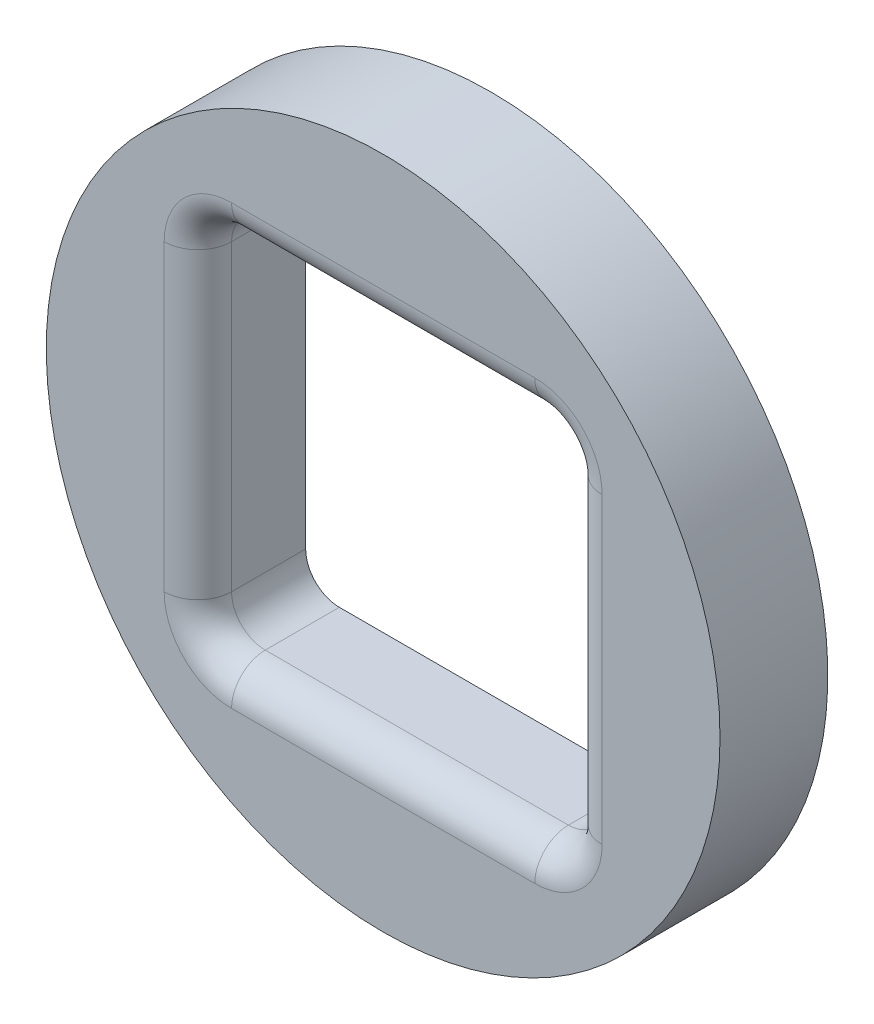
ISO-10303-21;
HEADER;
FILE_DESCRIPTION(('STEP AP214'),'2;1');
FILE_NAME('part.step','',(''),(''),'','','');
FILE_SCHEMA(('AUTOMOTIVE_DESIGN { 1 0 10303 214 1 1 1 1 }'));
ENDSEC;
DATA;
#1=APPLICATION_CONTEXT('core data for automotive mechanical design processes');
#2=APPLICATION_PROTOCOL_DEFINITION('international standard','automotive_design',2000,#1);
#3=PRODUCT_CONTEXT('',#1,'mechanical');
#4=PRODUCT('Part','Part','',(#3));
#5=PRODUCT_RELATED_PRODUCT_CATEGORY('part','',(#4));
#6=PRODUCT_DEFINITION_FORMATION('','',#4);
#7=PRODUCT_DEFINITION_CONTEXT('part definition',#1,'design');
#8=PRODUCT_DEFINITION('design','',#6,#7);
#9=PRODUCT_DEFINITION_SHAPE('','',#8);
#10=(LENGTH_UNIT() NAMED_UNIT(*) SI_UNIT(.MILLI.,.METRE.));
#11=(NAMED_UNIT(*) PLANE_ANGLE_UNIT() SI_UNIT($,.RADIAN.));
#12=(NAMED_UNIT(*) SI_UNIT($,.STERADIAN.) SOLID_ANGLE_UNIT());
#13=UNCERTAINTY_MEASURE_WITH_UNIT(LENGTH_MEASURE(1.E-05),#10,'distance_accuracy_value','');
#14=(GEOMETRIC_REPRESENTATION_CONTEXT(3) GLOBAL_UNCERTAINTY_ASSIGNED_CONTEXT((#13)) GLOBAL_UNIT_ASSIGNED_CONTEXT((#10,
#11,#12)) REPRESENTATION_CONTEXT('',''));
#15=CARTESIAN_POINT('',(0.,0.,0.));
#16=DIRECTION('',(0.,0.,1.));
#17=DIRECTION('',(1.,0.,0.));
#18=AXIS2_PLACEMENT_3D('',#15,#16,#17);
#19=CARTESIAN_POINT('',(16.25,0.,52.5));
#20=DIRECTION('',(0.,-1.,0.));
#21=DIRECTION('',(1.,0.,0.));
#22=AXIS2_PLACEMENT_3D('',#19,#20,#21);
#23=CYLINDRICAL_SURFACE('',#22,2.5);
#24=CARTESIAN_POINT('',(16.25,-11.25,52.5));
#25=DIRECTION('',(0.,-1.,0.));
#26=DIRECTION('',(0.,0.,-1.));
#27=AXIS2_PLACEMENT_3D('',#24,#25,#26);
#28=CIRCLE('',#27,2.5);
#29=CARTESIAN_POINT('',(16.25,-11.25,55.));
#30=VERTEX_POINT('',#29);
#31=CARTESIAN_POINT('',(13.75,-11.25,52.5));
#32=VERTEX_POINT('',#31);
#33=EDGE_CURVE('E54',#30,#32,#28,.T.);
#34=ORIENTED_EDGE('',*,*,#33,.F.);
#35=DIRECTION('',(0.,-1.,0.));
#36=VECTOR('',#35,1.);
#37=CARTESIAN_POINT('',(16.25,0.,55.));
#38=LINE('',#37,#36);
#39=CARTESIAN_POINT('',(16.25,11.25,55.));
#40=VERTEX_POINT('',#39);
#41=EDGE_CURVE('E187',#40,#30,#38,.T.);
#42=ORIENTED_EDGE('',*,*,#41,.F.);
#43=CARTESIAN_POINT('',(16.25,11.25,52.5));
#44=DIRECTION('',(0.,-1.,0.));
#45=DIRECTION('',(0.,0.,-1.));
#46=AXIS2_PLACEMENT_3D('',#43,#44,#45);
#47=CIRCLE('',#46,2.5);
#48=CARTESIAN_POINT('',(13.75,11.25,52.5));
#49=VERTEX_POINT('',#48);
#50=EDGE_CURVE('E68',#40,#49,#47,.T.);
#51=ORIENTED_EDGE('',*,*,#50,.T.);
#52=DIRECTION('',(0.,-1.,0.));
#53=VECTOR('',#52,1.);
#54=CARTESIAN_POINT('',(13.75,13.75,52.5));
#55=LINE('',#54,#53);
#56=EDGE_CURVE('E244',#32,#49,#55,.F.);
#57=ORIENTED_EDGE('',*,*,#56,.F.);
#58=EDGE_LOOP('',(#34,#42,#51,#57));
#59=FACE_BOUND('',#58,.T.);
#60=ADVANCED_FACE('F46',(#59),#23,.T.);
#61=CARTESIAN_POINT('',(11.25,11.25,52.5));
#62=DIRECTION('',(0.,0.,1.));
#63=DIRECTION('',(1.,0.,0.));
#64=AXIS2_PLACEMENT_3D('',#61,#62,#63);
#65=TOROIDAL_SURFACE('',#64,5.,2.5);
#66=ORIENTED_EDGE('',*,*,#50,.F.);
#67=CARTESIAN_POINT('',(11.25,11.25,55.));
#68=DIRECTION('',(0.,0.,1.));
#69=DIRECTION('',(1.,0.,0.));
#70=AXIS2_PLACEMENT_3D('',#67,#68,#69);
#71=CIRCLE('',#70,5.);
#72=CARTESIAN_POINT('',(11.25,16.25,55.));
#73=VERTEX_POINT('',#72);
#74=EDGE_CURVE('E191',#73,#40,#71,.F.);
#75=ORIENTED_EDGE('',*,*,#74,.F.);
#76=CARTESIAN_POINT('',(11.25,16.25,52.5));
#77=DIRECTION('',(1.,0.,0.));
#78=DIRECTION('',(0.,0.,-1.));
#79=AXIS2_PLACEMENT_3D('',#76,#77,#78);
#80=CIRCLE('',#79,2.5);
#81=CARTESIAN_POINT('',(11.25,13.75,52.5));
#82=VERTEX_POINT('',#81);
#83=EDGE_CURVE('E264',#73,#82,#80,.T.);
#84=ORIENTED_EDGE('',*,*,#83,.T.);
#85=CARTESIAN_POINT('',(11.25,11.25,52.5));
#86=DIRECTION('',(0.,0.,1.));
#87=DIRECTION('',(1.,0.,0.));
#88=AXIS2_PLACEMENT_3D('',#85,#86,#87);
#89=CIRCLE('',#88,2.5);
#90=EDGE_CURVE('E154',#49,#82,#89,.T.);
#91=ORIENTED_EDGE('',*,*,#90,.F.);
#92=EDGE_LOOP('',(#66,#75,#84,#91));
#93=FACE_BOUND('',#92,.T.);
#94=ADVANCED_FACE('F297',(#93),#65,.T.);
#95=CARTESIAN_POINT('',(0.,16.25,52.5));
#96=DIRECTION('',(1.,0.,0.));
#97=DIRECTION('',(0.,0.,-1.));
#98=AXIS2_PLACEMENT_3D('',#95,#96,#97);
#99=CYLINDRICAL_SURFACE('',#98,2.5);
#100=ORIENTED_EDGE('',*,*,#83,.F.);
#101=DIRECTION('',(1.,0.,0.));
#102=VECTOR('',#101,1.);
#103=CARTESIAN_POINT('',(0.,16.25,55.));
#104=LINE('',#103,#102);
#105=CARTESIAN_POINT('',(-11.25,16.25,55.));
#106=VERTEX_POINT('',#105);
#107=EDGE_CURVE('E195',#106,#73,#104,.T.);
#108=ORIENTED_EDGE('',*,*,#107,.F.);
#109=CARTESIAN_POINT('',(-11.25,16.25,52.5));
#110=DIRECTION('',(1.,0.,0.));
#111=DIRECTION('',(0.,0.,-1.));
#112=AXIS2_PLACEMENT_3D('',#109,#110,#111);
#113=CIRCLE('',#112,2.5);
#114=CARTESIAN_POINT('',(-11.25,13.75,52.5));
#115=VERTEX_POINT('',#114);
#116=EDGE_CURVE('E261',#106,#115,#113,.T.);
#117=ORIENTED_EDGE('',*,*,#116,.T.);
#118=DIRECTION('',(1.,0.,0.));
#119=VECTOR('',#118,1.);
#120=CARTESIAN_POINT('',(-13.75,13.75,52.5));
#121=LINE('',#120,#119);
#122=EDGE_CURVE('E239',#82,#115,#121,.F.);
#123=ORIENTED_EDGE('',*,*,#122,.F.);
#124=EDGE_LOOP('',(#100,#108,#117,#123));
#125=FACE_BOUND('',#124,.T.);
#126=ADVANCED_FACE('F332',(#125),#99,.T.);
#127=CARTESIAN_POINT('',(-11.25,11.25,52.5));
#128=DIRECTION('',(0.,0.,1.));
#129=DIRECTION('',(1.,0.,0.));
#130=AXIS2_PLACEMENT_3D('',#127,#128,#129);
#131=TOROIDAL_SURFACE('',#130,5.,2.5);
#132=ORIENTED_EDGE('',*,*,#116,.F.);
#133=CARTESIAN_POINT('',(-11.25,11.25,55.));
#134=DIRECTION('',(0.,0.,1.));
#135=DIRECTION('',(1.,0.,0.));
#136=AXIS2_PLACEMENT_3D('',#133,#134,#135);
#137=CIRCLE('',#136,5.);
#138=CARTESIAN_POINT('',(-16.25,11.25,55.));
#139=VERTEX_POINT('',#138);
#140=EDGE_CURVE('E199',#139,#106,#137,.F.);
#141=ORIENTED_EDGE('',*,*,#140,.F.);
#142=CARTESIAN_POINT('',(-16.25,11.25,52.5));
#143=DIRECTION('',(0.,1.,0.));
#144=DIRECTION('',(0.,0.,1.));
#145=AXIS2_PLACEMENT_3D('',#142,#143,#144);
#146=CIRCLE('',#145,2.5);
#147=CARTESIAN_POINT('',(-13.75,11.25,52.5));
#148=VERTEX_POINT('',#147);
#149=EDGE_CURVE('E257',#139,#148,#146,.T.);
#150=ORIENTED_EDGE('',*,*,#149,.T.);
#151=CARTESIAN_POINT('',(-11.25,11.25,52.5));
#152=DIRECTION('',(0.,0.,1.));
#153=DIRECTION('',(1.,0.,0.));
#154=AXIS2_PLACEMENT_3D('',#151,#152,#153);
#155=CIRCLE('',#154,2.5);
#156=EDGE_CURVE('E235',#115,#148,#155,.T.);
#157=ORIENTED_EDGE('',*,*,#156,.F.);
#158=EDGE_LOOP('',(#132,#141,#150,#157));
#159=FACE_BOUND('',#158,.T.);
#160=ADVANCED_FACE('F336',(#159),#131,.T.);
#161=CARTESIAN_POINT('',(-16.25,0.,52.5));
#162=DIRECTION('',(0.,1.,0.));
#163=DIRECTION('',(-1.,0.,0.));
#164=AXIS2_PLACEMENT_3D('',#161,#162,#163);
#165=CYLINDRICAL_SURFACE('',#164,2.5);
#166=ORIENTED_EDGE('',*,*,#149,.F.);
#167=DIRECTION('',(0.,1.,0.));
#168=VECTOR('',#167,1.);
#169=CARTESIAN_POINT('',(-16.25,0.,55.));
#170=LINE('',#169,#168);
#171=CARTESIAN_POINT('',(-16.25,-11.25,55.));
#172=VERTEX_POINT('',#171);
#173=EDGE_CURVE('E203',#172,#139,#170,.T.);
#174=ORIENTED_EDGE('',*,*,#173,.F.);
#175=CARTESIAN_POINT('',(-16.25,-11.25,52.5));
#176=DIRECTION('',(0.,1.,0.));
#177=DIRECTION('',(0.,0.,1.));
#178=AXIS2_PLACEMENT_3D('',#175,#176,#177);
#179=CIRCLE('',#178,2.5);
#180=CARTESIAN_POINT('',(-13.75,-11.25,52.5));
#181=VERTEX_POINT('',#180);
#182=EDGE_CURVE('E254',#172,#181,#179,.T.);
#183=ORIENTED_EDGE('',*,*,#182,.T.);
#184=DIRECTION('',(0.,1.,0.));
#185=VECTOR('',#184,1.);
#186=CARTESIAN_POINT('',(-13.75,13.75,52.5));
#187=LINE('',#186,#185);
#188=EDGE_CURVE('E231',#148,#181,#187,.F.);
#189=ORIENTED_EDGE('',*,*,#188,.F.);
#190=EDGE_LOOP('',(#166,#174,#183,#189));
#191=FACE_BOUND('',#190,.T.);
#192=ADVANCED_FACE('F342',(#191),#165,.T.);
#193=CARTESIAN_POINT('',(-11.25,-11.25,52.5));
#194=DIRECTION('',(0.,0.,1.));
#195=DIRECTION('',(1.,0.,0.));
#196=AXIS2_PLACEMENT_3D('',#193,#194,#195);
#197=TOROIDAL_SURFACE('',#196,5.,2.5);
#198=ORIENTED_EDGE('',*,*,#182,.F.);
#199=CARTESIAN_POINT('',(-11.25,-11.25,55.));
#200=DIRECTION('',(0.,0.,1.));
#201=DIRECTION('',(1.,0.,0.));
#202=AXIS2_PLACEMENT_3D('',#199,#200,#201);
#203=CIRCLE('',#202,5.);
#204=CARTESIAN_POINT('',(-11.25,-16.25,55.));
#205=VERTEX_POINT('',#204);
#206=EDGE_CURVE('E207',#205,#172,#203,.F.);
#207=ORIENTED_EDGE('',*,*,#206,.F.);
#208=CARTESIAN_POINT('',(-11.25,-16.25,52.5));
#209=DIRECTION('',(-1.,0.,0.));
#210=DIRECTION('',(0.,0.,1.));
#211=AXIS2_PLACEMENT_3D('',#208,#209,#210);
#212=CIRCLE('',#211,2.5);
#213=CARTESIAN_POINT('',(-11.25,-13.75,52.5));
#214=VERTEX_POINT('',#213);
#215=EDGE_CURVE('E250',#205,#214,#212,.T.);
#216=ORIENTED_EDGE('',*,*,#215,.T.);
#217=CARTESIAN_POINT('',(-11.25,-11.25,52.5));
#218=DIRECTION('',(0.,0.,1.));
#219=DIRECTION('',(1.,0.,0.));
#220=AXIS2_PLACEMENT_3D('',#217,#218,#219);
#221=CIRCLE('',#220,2.5);
#222=EDGE_CURVE('E227',#181,#214,#221,.T.);
#223=ORIENTED_EDGE('',*,*,#222,.F.);
#224=EDGE_LOOP('',(#198,#207,#216,#223));
#225=FACE_BOUND('',#224,.T.);
#226=ADVANCED_FACE('F346',(#225),#197,.T.);
#227=CARTESIAN_POINT('',(0.,-16.25,52.5));
#228=DIRECTION('',(-1.,0.,0.));
#229=DIRECTION('',(0.,0.,1.));
#230=AXIS2_PLACEMENT_3D('',#227,#228,#229);
#231=CYLINDRICAL_SURFACE('',#230,2.5);
#232=ORIENTED_EDGE('',*,*,#215,.F.);
#233=DIRECTION('',(-1.,0.,0.));
#234=VECTOR('',#233,1.);
#235=CARTESIAN_POINT('',(0.,-16.25,55.));
#236=LINE('',#235,#234);
#237=CARTESIAN_POINT('',(11.25,-16.25,55.));
#238=VERTEX_POINT('',#237);
#239=EDGE_CURVE('E211',#238,#205,#236,.T.);
#240=ORIENTED_EDGE('',*,*,#239,.F.);
#241=CARTESIAN_POINT('',(11.25,-16.25,52.5));
#242=DIRECTION('',(-1.,0.,0.));
#243=DIRECTION('',(0.,0.,1.));
#244=AXIS2_PLACEMENT_3D('',#241,#242,#243);
#245=CIRCLE('',#244,2.5);
#246=CARTESIAN_POINT('',(11.25,-13.75,52.5));
#247=VERTEX_POINT('',#246);
#248=EDGE_CURVE('E247',#238,#247,#245,.T.);
#249=ORIENTED_EDGE('',*,*,#248,.T.);
#250=DIRECTION('',(-1.,0.,0.));
#251=VECTOR('',#250,1.);
#252=CARTESIAN_POINT('',(-13.75,-13.75,52.5));
#253=LINE('',#252,#251);
#254=EDGE_CURVE('E223',#214,#247,#253,.F.);
#255=ORIENTED_EDGE('',*,*,#254,.F.);
#256=EDGE_LOOP('',(#232,#240,#249,#255));
#257=FACE_BOUND('',#256,.T.);
#258=ADVANCED_FACE('F288',(#257),#231,.T.);
#259=CARTESIAN_POINT('',(11.25,-11.25,52.5));
#260=DIRECTION('',(0.,0.,1.));
#261=DIRECTION('',(1.,0.,0.));
#262=AXIS2_PLACEMENT_3D('',#259,#260,#261);
#263=TOROIDAL_SURFACE('',#262,5.,2.5);
#264=CARTESIAN_POINT('',(11.25,-11.25,55.));
#265=DIRECTION('',(0.,0.,1.));
#266=DIRECTION('',(1.,0.,0.));
#267=AXIS2_PLACEMENT_3D('',#264,#265,#266);
#268=CIRCLE('',#267,5.);
#269=EDGE_CURVE('E215',#30,#238,#268,.F.);
#270=ORIENTED_EDGE('',*,*,#269,.F.);
#271=ORIENTED_EDGE('',*,*,#33,.T.);
#272=CARTESIAN_POINT('',(11.25,-11.25,52.5));
#273=DIRECTION('',(0.,0.,1.));
#274=DIRECTION('',(1.,0.,0.));
#275=AXIS2_PLACEMENT_3D('',#272,#273,#274);
#276=CIRCLE('',#275,2.5);
#277=EDGE_CURVE('E219',#247,#32,#276,.T.);
#278=ORIENTED_EDGE('',*,*,#277,.F.);
#279=ORIENTED_EDGE('',*,*,#248,.F.);
#280=EDGE_LOOP('',(#270,#271,#278,#279));
#281=FACE_BOUND('',#280,.T.);
#282=ADVANCED_FACE('F273',(#281),#263,.T.);
#283=CARTESIAN_POINT('',(0.,0.,55.));
#284=DIRECTION('',(0.,0.,1.));
#285=DIRECTION('',(1.,0.,0.));
#286=AXIS2_PLACEMENT_3D('',#283,#284,#285);
#287=PLANE('',#286);
#288=ORIENTED_EDGE('',*,*,#41,.T.);
#289=ORIENTED_EDGE('',*,*,#269,.T.);
#290=ORIENTED_EDGE('',*,*,#239,.T.);
#291=ORIENTED_EDGE('',*,*,#206,.T.);
#292=ORIENTED_EDGE('',*,*,#173,.T.);
#293=ORIENTED_EDGE('',*,*,#140,.T.);
#294=ORIENTED_EDGE('',*,*,#107,.T.);
#295=ORIENTED_EDGE('',*,*,#74,.T.);
#296=EDGE_LOOP('',(#288,#289,#290,#291,#292,#293,#294,#295));
#297=FACE_BOUND('',#296,.T.);
#298=CARTESIAN_POINT('',(0.,0.,55.));
#299=DIRECTION('',(0.,0.,1.));
#300=DIRECTION('',(1.,0.,0.));
#301=AXIS2_PLACEMENT_3D('',#298,#299,#300);
#302=CIRCLE('',#301,25.);
#303=CARTESIAN_POINT('',(25.,0.,55.));
#304=VERTEX_POINT('',#303);
#305=EDGE_CURVE('E157',#304,#304,#302,.T.);
#306=ORIENTED_EDGE('',*,*,#305,.T.);
#307=EDGE_LOOP('',(#306));
#308=FACE_BOUND('',#307,.T.);
#309=ADVANCED_FACE('F291',(#297,#308),#287,.T.);
#310=CARTESIAN_POINT('',(0.,0.,55.));
#311=DIRECTION('',(0.,0.,-1.));
#312=DIRECTION('',(-1.,0.,0.));
#313=AXIS2_PLACEMENT_3D('',#310,#311,#312);
#314=CYLINDRICAL_SURFACE('',#313,25.);
#315=CARTESIAN_POINT('',(0.,0.,47.));
#316=DIRECTION('',(0.,0.,1.));
#317=DIRECTION('',(0.,-1.,0.));
#318=AXIS2_PLACEMENT_3D('',#315,#316,#317);
#319=CIRCLE('',#318,25.);
#320=CARTESIAN_POINT('',(0.,-25.,47.));
#321=VERTEX_POINT('',#320);
#322=EDGE_CURVE('E164',#321,#321,#319,.T.);
#323=ORIENTED_EDGE('',*,*,#322,.T.);
#324=EDGE_LOOP('',(#323));
#325=FACE_BOUND('',#324,.T.);
#326=ORIENTED_EDGE('',*,*,#305,.F.);
#327=EDGE_LOOP('',(#326));
#328=FACE_BOUND('',#327,.T.);
#329=ADVANCED_FACE('F319',(#325,#328),#314,.T.);
#330=CARTESIAN_POINT('',(-13.75,13.75,55.));
#331=DIRECTION('',(1.,0.,0.));
#332=DIRECTION('',(0.,1.,0.));
#333=AXIS2_PLACEMENT_3D('',#330,#331,#332);
#334=PLANE('',#333);
#335=DIRECTION('',(0.,-1.,0.));
#336=VECTOR('',#335,1.);
#337=CARTESIAN_POINT('',(-13.75,13.75,47.));
#338=LINE('',#337,#336);
#339=CARTESIAN_POINT('',(-13.75,11.25,47.));
#340=VERTEX_POINT('',#339);
#341=CARTESIAN_POINT('',(-13.75,-11.25,47.));
#342=VERTEX_POINT('',#341);
#343=EDGE_CURVE('E309',#340,#342,#338,.T.);
#344=ORIENTED_EDGE('',*,*,#343,.F.);
#345=DIRECTION('',(0.,0.,-1.));
#346=VECTOR('',#345,1.);
#347=CARTESIAN_POINT('',(-13.75,11.25,55.));
#348=LINE('',#347,#346);
#349=EDGE_CURVE('E171',#340,#148,#348,.F.);
#350=ORIENTED_EDGE('',*,*,#349,.T.);
#351=ORIENTED_EDGE('',*,*,#188,.T.);
#352=DIRECTION('',(0.,0.,-1.));
#353=VECTOR('',#352,1.);
#354=CARTESIAN_POINT('',(-13.75,-11.25,0.));
#355=LINE('',#354,#353);
#356=EDGE_CURVE('E161',#181,#342,#355,.T.);
#357=ORIENTED_EDGE('',*,*,#356,.T.);
#358=EDGE_LOOP('',(#344,#350,#351,#357));
#359=FACE_BOUND('',#358,.T.);
#360=ADVANCED_FACE('F367',(#359),#334,.T.);
#361=CARTESIAN_POINT('',(-13.75,-13.75,55.));
#362=DIRECTION('',(0.,1.,0.));
#363=DIRECTION('',(0.,0.,1.));
#364=AXIS2_PLACEMENT_3D('',#361,#362,#363);
#365=PLANE('',#364);
#366=DIRECTION('',(1.,0.,0.));
#367=VECTOR('',#366,1.);
#368=CARTESIAN_POINT('',(-13.75,-13.75,47.));
#369=LINE('',#368,#367);
#370=CARTESIAN_POINT('',(-11.25,-13.75,47.));
#371=VERTEX_POINT('',#370);
#372=CARTESIAN_POINT('',(11.25,-13.75,47.));
#373=VERTEX_POINT('',#372);
#374=EDGE_CURVE('E284',#371,#373,#369,.T.);
#375=ORIENTED_EDGE('',*,*,#374,.F.);
#376=DIRECTION('',(0.,0.,-1.));
#377=VECTOR('',#376,1.);
#378=CARTESIAN_POINT('',(-11.25,-13.75,55.));
#379=LINE('',#378,#377);
#380=EDGE_CURVE('E178',#371,#214,#379,.F.);
#381=ORIENTED_EDGE('',*,*,#380,.T.);
#382=ORIENTED_EDGE('',*,*,#254,.T.);
#383=DIRECTION('',(0.,0.,-1.));
#384=VECTOR('',#383,1.);
#385=CARTESIAN_POINT('',(11.25,-13.75,0.));
#386=LINE('',#385,#384);
#387=EDGE_CURVE('E174',#247,#373,#386,.T.);
#388=ORIENTED_EDGE('',*,*,#387,.T.);
#389=EDGE_LOOP('',(#375,#381,#382,#388));
#390=FACE_BOUND('',#389,.T.);
#391=ADVANCED_FACE('F283',(#390),#365,.T.);
#392=CARTESIAN_POINT('',(13.75,13.75,55.));
#393=DIRECTION('',(-1.,0.,0.));
#394=DIRECTION('',(0.,-1.,0.));
#395=AXIS2_PLACEMENT_3D('',#392,#393,#394);
#396=PLANE('',#395);
#397=DIRECTION('',(0.,1.,0.));
#398=VECTOR('',#397,1.);
#399=CARTESIAN_POINT('',(13.75,13.75,47.));
#400=LINE('',#399,#398);
#401=CARTESIAN_POINT('',(13.75,-11.25,47.));
#402=VERTEX_POINT('',#401);
#403=CARTESIAN_POINT('',(13.75,11.25,47.));
#404=VERTEX_POINT('',#403);
#405=EDGE_CURVE('E61',#402,#404,#400,.T.);
#406=ORIENTED_EDGE('',*,*,#405,.F.);
#407=DIRECTION('',(0.,0.,-1.));
#408=VECTOR('',#407,1.);
#409=CARTESIAN_POINT('',(13.75,-11.25,55.));
#410=LINE('',#409,#408);
#411=EDGE_CURVE('E184',#402,#32,#410,.F.);
#412=ORIENTED_EDGE('',*,*,#411,.T.);
#413=ORIENTED_EDGE('',*,*,#56,.T.);
#414=DIRECTION('',(0.,0.,-1.));
#415=VECTOR('',#414,1.);
#416=CARTESIAN_POINT('',(13.75,11.25,0.));
#417=LINE('',#416,#415);
#418=EDGE_CURVE('E181',#49,#404,#417,.T.);
#419=ORIENTED_EDGE('',*,*,#418,.T.);
#420=EDGE_LOOP('',(#406,#412,#413,#419));
#421=FACE_BOUND('',#420,.T.);
#422=ADVANCED_FACE('F298',(#421),#396,.T.);
#423=CARTESIAN_POINT('',(-13.75,13.75,55.));
#424=DIRECTION('',(0.,-1.,0.));
#425=DIRECTION('',(0.,0.,-1.));
#426=AXIS2_PLACEMENT_3D('',#423,#424,#425);
#427=PLANE('',#426);
#428=DIRECTION('',(-1.,0.,0.));
#429=VECTOR('',#428,1.);
#430=CARTESIAN_POINT('',(-13.75,13.75,47.));
#431=LINE('',#430,#429);
#432=CARTESIAN_POINT('',(11.25,13.75,47.));
#433=VERTEX_POINT('',#432);
#434=CARTESIAN_POINT('',(-11.25,13.75,47.));
#435=VERTEX_POINT('',#434);
#436=EDGE_CURVE('E135',#433,#435,#431,.T.);
#437=ORIENTED_EDGE('',*,*,#436,.F.);
#438=DIRECTION('',(0.,0.,-1.));
#439=VECTOR('',#438,1.);
#440=CARTESIAN_POINT('',(11.25,13.75,55.));
#441=LINE('',#440,#439);
#442=EDGE_CURVE('E145',#433,#82,#441,.F.);
#443=ORIENTED_EDGE('',*,*,#442,.T.);
#444=ORIENTED_EDGE('',*,*,#122,.T.);
#445=DIRECTION('',(0.,0.,-1.));
#446=VECTOR('',#445,1.);
#447=CARTESIAN_POINT('',(-11.25,13.75,0.));
#448=LINE('',#447,#446);
#449=EDGE_CURVE('E148',#115,#435,#448,.T.);
#450=ORIENTED_EDGE('',*,*,#449,.T.);
#451=EDGE_LOOP('',(#437,#443,#444,#450));
#452=FACE_BOUND('',#451,.T.);
#453=ADVANCED_FACE('F143',(#452),#427,.T.);
#454=CARTESIAN_POINT('',(-11.25,11.25,55.));
#455=DIRECTION('',(0.,0.,1.));
#456=DIRECTION('',(1.,0.,0.));
#457=AXIS2_PLACEMENT_3D('',#454,#455,#456);
#458=CYLINDRICAL_SURFACE('',#457,2.5);
#459=ORIENTED_EDGE('',*,*,#349,.F.);
#460=CARTESIAN_POINT('',(-11.25,11.25,47.));
#461=DIRECTION('',(0.,0.,1.));
#462=DIRECTION('',(0.,-1.,0.));
#463=AXIS2_PLACEMENT_3D('',#460,#461,#462);
#464=CIRCLE('',#463,2.5);
#465=EDGE_CURVE('E302',#340,#435,#464,.F.);
#466=ORIENTED_EDGE('',*,*,#465,.T.);
#467=ORIENTED_EDGE('',*,*,#449,.F.);
#468=ORIENTED_EDGE('',*,*,#156,.T.);
#469=EDGE_LOOP('',(#459,#466,#467,#468));
#470=FACE_BOUND('',#469,.T.);
#471=ADVANCED_FACE('F360',(#470),#458,.F.);
#472=CARTESIAN_POINT('',(-11.25,-11.25,55.));
#473=DIRECTION('',(0.,0.,1.));
#474=DIRECTION('',(1.,0.,0.));
#475=AXIS2_PLACEMENT_3D('',#472,#473,#474);
#476=CYLINDRICAL_SURFACE('',#475,2.5);
#477=ORIENTED_EDGE('',*,*,#380,.F.);
#478=CARTESIAN_POINT('',(-11.25,-11.25,47.));
#479=DIRECTION('',(0.,0.,1.));
#480=DIRECTION('',(0.,-1.,0.));
#481=AXIS2_PLACEMENT_3D('',#478,#479,#480);
#482=CIRCLE('',#481,2.5);
#483=EDGE_CURVE('E312',#371,#342,#482,.F.);
#484=ORIENTED_EDGE('',*,*,#483,.T.);
#485=ORIENTED_EDGE('',*,*,#356,.F.);
#486=ORIENTED_EDGE('',*,*,#222,.T.);
#487=EDGE_LOOP('',(#477,#484,#485,#486));
#488=FACE_BOUND('',#487,.T.);
#489=ADVANCED_FACE('F357',(#488),#476,.F.);
#490=CARTESIAN_POINT('',(11.25,-11.25,55.));
#491=DIRECTION('',(0.,0.,1.));
#492=DIRECTION('',(1.,0.,0.));
#493=AXIS2_PLACEMENT_3D('',#490,#491,#492);
#494=CYLINDRICAL_SURFACE('',#493,2.5);
#495=ORIENTED_EDGE('',*,*,#411,.F.);
#496=CARTESIAN_POINT('',(11.25,-11.25,47.));
#497=DIRECTION('',(0.,0.,1.));
#498=DIRECTION('',(0.,-1.,0.));
#499=AXIS2_PLACEMENT_3D('',#496,#497,#498);
#500=CIRCLE('',#499,2.5);
#501=EDGE_CURVE('E280',#402,#373,#500,.F.);
#502=ORIENTED_EDGE('',*,*,#501,.T.);
#503=ORIENTED_EDGE('',*,*,#387,.F.);
#504=ORIENTED_EDGE('',*,*,#277,.T.);
#505=EDGE_LOOP('',(#495,#502,#503,#504));
#506=FACE_BOUND('',#505,.T.);
#507=ADVANCED_FACE('F278',(#506),#494,.F.);
#508=CARTESIAN_POINT('',(11.25,11.25,55.));
#509=DIRECTION('',(0.,0.,1.));
#510=DIRECTION('',(1.,0.,0.));
#511=AXIS2_PLACEMENT_3D('',#508,#509,#510);
#512=CYLINDRICAL_SURFACE('',#511,2.5);
#513=ORIENTED_EDGE('',*,*,#442,.F.);
#514=CARTESIAN_POINT('',(11.25,11.25,47.));
#515=DIRECTION('',(0.,0.,1.));
#516=DIRECTION('',(0.,-1.,0.));
#517=AXIS2_PLACEMENT_3D('',#514,#515,#516);
#518=CIRCLE('',#517,2.5);
#519=EDGE_CURVE('E11',#433,#404,#518,.F.);
#520=ORIENTED_EDGE('',*,*,#519,.T.);
#521=ORIENTED_EDGE('',*,*,#418,.F.);
#522=ORIENTED_EDGE('',*,*,#90,.T.);
#523=EDGE_LOOP('',(#513,#520,#521,#522));
#524=FACE_BOUND('',#523,.T.);
#525=ADVANCED_FACE('F152',(#524),#512,.F.);
#526=CARTESIAN_POINT('',(-25.,25.,47.));
#527=DIRECTION('',(0.,0.,1.));
#528=DIRECTION('',(0.,-1.,0.));
#529=AXIS2_PLACEMENT_3D('',#526,#527,#528);
#530=PLANE('',#529);
#531=ORIENTED_EDGE('',*,*,#374,.T.);
#532=ORIENTED_EDGE('',*,*,#501,.F.);
#533=ORIENTED_EDGE('',*,*,#405,.T.);
#534=ORIENTED_EDGE('',*,*,#519,.F.);
#535=ORIENTED_EDGE('',*,*,#436,.T.);
#536=ORIENTED_EDGE('',*,*,#465,.F.);
#537=ORIENTED_EDGE('',*,*,#343,.T.);
#538=ORIENTED_EDGE('',*,*,#483,.F.);
#539=EDGE_LOOP('',(#531,#532,#533,#534,#535,#536,#537,#538));
#540=FACE_BOUND('',#539,.T.);
#541=ORIENTED_EDGE('',*,*,#322,.F.);
#542=EDGE_LOOP('',(#541));
#543=FACE_BOUND('',#542,.T.);
#544=ADVANCED_FACE('F133',(#540,#543),#530,.F.);
#545=CLOSED_SHELL('',(#60,#94,#126,#160,#192,#226,#258,#282,#309,#329,#360,#391,#422,#453,#471,
#489,#507,#525,#544));
#546=MANIFOLD_SOLID_BREP('B2',#545);
#547=ADVANCED_BREP_SHAPE_REPRESENTATION('',(#18,#546),#14);
#548=SHAPE_DEFINITION_REPRESENTATION(#9,#547);
ENDSEC;
END-ISO-10303-21;
